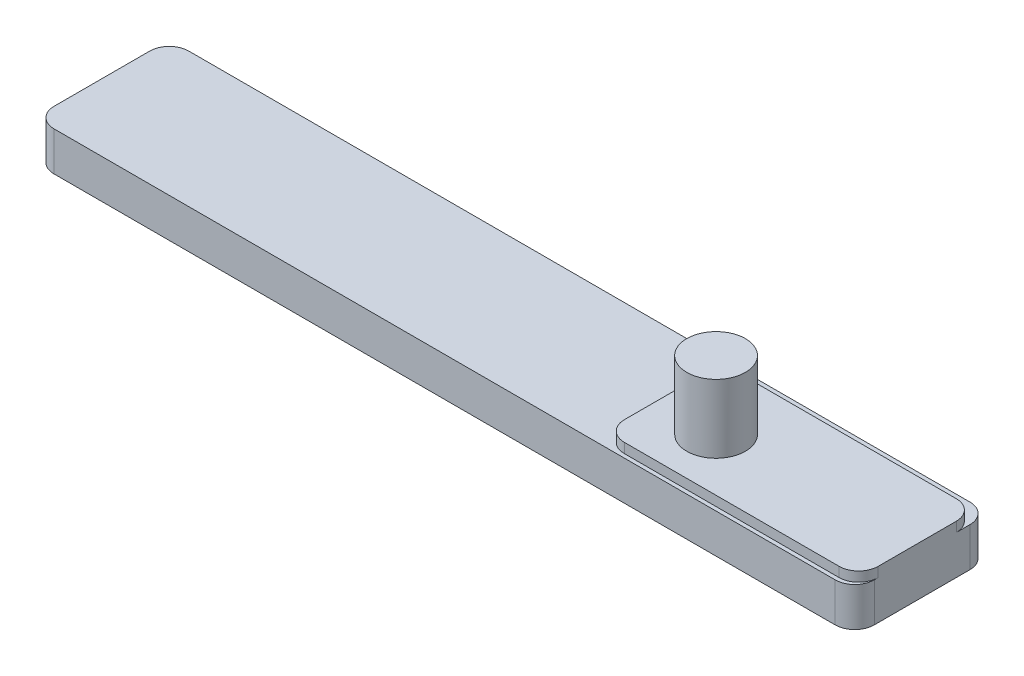
ISO-10303-21;
HEADER;
FILE_DESCRIPTION(('STEP AP214'),'2;1');
FILE_NAME('part.step','',(''),(''),'','','');
FILE_SCHEMA(('AUTOMOTIVE_DESIGN { 1 0 10303 214 1 1 1 1 }'));
ENDSEC;
DATA;
#1=APPLICATION_CONTEXT('core data for automotive mechanical design processes');
#2=APPLICATION_PROTOCOL_DEFINITION('international standard','automotive_design',2000,#1);
#3=PRODUCT_CONTEXT('',#1,'mechanical');
#4=PRODUCT('Part','Part','',(#3));
#5=PRODUCT_RELATED_PRODUCT_CATEGORY('part','',(#4));
#6=PRODUCT_DEFINITION_FORMATION('','',#4);
#7=PRODUCT_DEFINITION_CONTEXT('part definition',#1,'design');
#8=PRODUCT_DEFINITION('design','',#6,#7);
#9=PRODUCT_DEFINITION_SHAPE('','',#8);
#10=(LENGTH_UNIT() NAMED_UNIT(*) SI_UNIT(.MILLI.,.METRE.));
#11=(NAMED_UNIT(*) PLANE_ANGLE_UNIT() SI_UNIT($,.RADIAN.));
#12=(NAMED_UNIT(*) SI_UNIT($,.STERADIAN.) SOLID_ANGLE_UNIT());
#13=UNCERTAINTY_MEASURE_WITH_UNIT(LENGTH_MEASURE(1.E-05),#10,'distance_accuracy_value','');
#14=(GEOMETRIC_REPRESENTATION_CONTEXT(3) GLOBAL_UNCERTAINTY_ASSIGNED_CONTEXT((#13)) GLOBAL_UNIT_ASSIGNED_CONTEXT((#10,
#11,#12)) REPRESENTATION_CONTEXT('',''));
#15=CARTESIAN_POINT('',(0.,0.,0.));
#16=DIRECTION('',(0.,0.,1.));
#17=DIRECTION('',(1.,0.,0.));
#18=AXIS2_PLACEMENT_3D('',#15,#16,#17);
#19=CARTESIAN_POINT('',(0.,2.5,-7.4));
#20=DIRECTION('',(0.,0.,1.));
#21=DIRECTION('',(1.,0.,0.));
#22=AXIS2_PLACEMENT_3D('',#19,#20,#21);
#23=PLANE('',#22);
#24=DIRECTION('',(-1.,0.,0.));
#25=VECTOR('',#24,1.);
#26=CARTESIAN_POINT('',(0.,2.,-7.4));
#27=LINE('',#26,#25);
#28=CARTESIAN_POINT('',(41.,2.,-7.4));
#29=VERTEX_POINT('',#28);
#30=CARTESIAN_POINT('',(1.,2.,-7.4));
#31=VERTEX_POINT('',#30);
#32=EDGE_CURVE('E234',#29,#31,#27,.T.);
#33=ORIENTED_EDGE('',*,*,#32,.F.);
#34=DIRECTION('',(0.,-1.,0.));
#35=VECTOR('',#34,1.);
#36=CARTESIAN_POINT('',(41.,2.5,-7.4));
#37=LINE('',#36,#35);
#38=CARTESIAN_POINT('',(41.,0.,-7.4));
#39=VERTEX_POINT('',#38);
#40=EDGE_CURVE('E11',#29,#39,#37,.T.);
#41=ORIENTED_EDGE('',*,*,#40,.T.);
#42=DIRECTION('',(-1.,0.,0.));
#43=VECTOR('',#42,1.);
#44=CARTESIAN_POINT('',(0.,0.,-7.4));
#45=LINE('',#44,#43);
#46=CARTESIAN_POINT('',(1.,0.,-7.4));
#47=VERTEX_POINT('',#46);
#48=EDGE_CURVE('E246',#39,#47,#45,.T.);
#49=ORIENTED_EDGE('',*,*,#48,.T.);
#50=DIRECTION('',(0.,-1.,0.));
#51=VECTOR('',#50,1.);
#52=CARTESIAN_POINT('',(1.,2.5,-7.4));
#53=LINE('',#52,#51);
#54=EDGE_CURVE('E282',#47,#31,#53,.F.);
#55=ORIENTED_EDGE('',*,*,#54,.T.);
#56=EDGE_LOOP('',(#33,#41,#49,#55));
#57=FACE_BOUND('',#56,.T.);
#58=ADVANCED_FACE('F39',(#57),#23,.F.);
#59=CARTESIAN_POINT('',(0.,2.5,0.));
#60=DIRECTION('',(1.,0.,0.));
#61=DIRECTION('',(0.,0.,-1.));
#62=AXIS2_PLACEMENT_3D('',#59,#60,#61);
#63=PLANE('',#62);
#64=DIRECTION('',(0.,0.,1.));
#65=VECTOR('',#64,1.);
#66=CARTESIAN_POINT('',(0.,2.,-7.4));
#67=LINE('',#66,#65);
#68=CARTESIAN_POINT('',(0.,2.,-6.4));
#69=VERTEX_POINT('',#68);
#70=CARTESIAN_POINT('',(0.,2.,-1.5));
#71=VERTEX_POINT('',#70);
#72=EDGE_CURVE('E228',#69,#71,#67,.T.);
#73=ORIENTED_EDGE('',*,*,#72,.F.);
#74=DIRECTION('',(0.,-1.,0.));
#75=VECTOR('',#74,1.);
#76=CARTESIAN_POINT('',(0.,2.5,-6.4));
#77=LINE('',#76,#75);
#78=CARTESIAN_POINT('',(0.,0.,-6.4));
#79=VERTEX_POINT('',#78);
#80=EDGE_CURVE('E274',#69,#79,#77,.T.);
#81=ORIENTED_EDGE('',*,*,#80,.T.);
#82=DIRECTION('',(0.,0.,1.));
#83=VECTOR('',#82,1.);
#84=CARTESIAN_POINT('',(0.,0.,0.));
#85=LINE('',#84,#83);
#86=CARTESIAN_POINT('',(0.,0.,-1.5));
#87=VERTEX_POINT('',#86);
#88=EDGE_CURVE('E242',#79,#87,#85,.T.);
#89=ORIENTED_EDGE('',*,*,#88,.T.);
#90=DIRECTION('',(0.,1.,0.));
#91=VECTOR('',#90,1.);
#92=CARTESIAN_POINT('',(0.,2.5,-1.5));
#93=LINE('',#92,#91);
#94=EDGE_CURVE('E271',#87,#71,#93,.T.);
#95=ORIENTED_EDGE('',*,*,#94,.T.);
#96=EDGE_LOOP('',(#73,#81,#89,#95));
#97=FACE_BOUND('',#96,.T.);
#98=ADVANCED_FACE('F321',(#97),#63,.F.);
#99=CARTESIAN_POINT('',(42.,2.5,0.));
#100=DIRECTION('',(-1.,0.,0.));
#101=DIRECTION('',(0.,0.,1.));
#102=AXIS2_PLACEMENT_3D('',#99,#100,#101);
#103=PLANE('',#102);
#104=DIRECTION('',(0.,0.,1.));
#105=VECTOR('',#104,1.);
#106=CARTESIAN_POINT('',(42.,2.,0.));
#107=LINE('',#106,#105);
#108=CARTESIAN_POINT('',(42.,2.,-1.7));
#109=VERTEX_POINT('',#108);
#110=CARTESIAN_POINT('',(42.,2.,-1.5));
#111=VERTEX_POINT('',#110);
#112=EDGE_CURVE('E174',#109,#111,#107,.T.);
#113=ORIENTED_EDGE('',*,*,#112,.T.);
#114=DIRECTION('',(0.,1.,0.));
#115=VECTOR('',#114,1.);
#116=CARTESIAN_POINT('',(42.,2.5,-1.5));
#117=LINE('',#116,#115);
#118=CARTESIAN_POINT('',(42.,0.,-1.5));
#119=VERTEX_POINT('',#118);
#120=EDGE_CURVE('E198',#111,#119,#117,.F.);
#121=ORIENTED_EDGE('',*,*,#120,.T.);
#122=DIRECTION('',(0.,0.,-1.));
#123=VECTOR('',#122,1.);
#124=CARTESIAN_POINT('',(42.,0.,0.));
#125=LINE('',#124,#123);
#126=CARTESIAN_POINT('',(42.,0.,-6.4));
#127=VERTEX_POINT('',#126);
#128=EDGE_CURVE('E205',#119,#127,#125,.T.);
#129=ORIENTED_EDGE('',*,*,#128,.T.);
#130=DIRECTION('',(0.,-1.,0.));
#131=VECTOR('',#130,1.);
#132=CARTESIAN_POINT('',(42.,2.5,-6.4));
#133=LINE('',#132,#131);
#134=CARTESIAN_POINT('',(42.,2.,-6.4));
#135=VERTEX_POINT('',#134);
#136=EDGE_CURVE('E196',#127,#135,#133,.F.);
#137=ORIENTED_EDGE('',*,*,#136,.T.);
#138=DIRECTION('',(0.,0.,1.));
#139=VECTOR('',#138,1.);
#140=CARTESIAN_POINT('',(42.,2.,-7.4));
#141=LINE('',#140,#139);
#142=CARTESIAN_POINT('',(42.,2.,-5.7));
#143=VERTEX_POINT('',#142);
#144=EDGE_CURVE('E310',#135,#143,#141,.T.);
#145=ORIENTED_EDGE('',*,*,#144,.T.);
#146=DIRECTION('',(0.,1.,0.));
#147=VECTOR('',#146,1.);
#148=CARTESIAN_POINT('',(42.,2.5,-5.7));
#149=LINE('',#148,#147);
#150=CARTESIAN_POINT('',(42.,2.5,-5.7));
#151=VERTEX_POINT('',#150);
#152=EDGE_CURVE('E262',#143,#151,#149,.T.);
#153=ORIENTED_EDGE('',*,*,#152,.T.);
#154=DIRECTION('',(0.,0.,-1.));
#155=VECTOR('',#154,1.);
#156=CARTESIAN_POINT('',(42.,2.5,0.));
#157=LINE('',#156,#155);
#158=CARTESIAN_POINT('',(42.,2.5,-1.7));
#159=VERTEX_POINT('',#158);
#160=EDGE_CURVE('E243',#159,#151,#157,.T.);
#161=ORIENTED_EDGE('',*,*,#160,.F.);
#162=DIRECTION('',(0.,1.,0.));
#163=VECTOR('',#162,1.);
#164=CARTESIAN_POINT('',(42.,2.5,-1.7));
#165=LINE('',#164,#163);
#166=EDGE_CURVE('E223',#159,#109,#165,.F.);
#167=ORIENTED_EDGE('',*,*,#166,.T.);
#168=EDGE_LOOP('',(#113,#121,#129,#137,#145,#153,#161,#167));
#169=FACE_BOUND('',#168,.T.);
#170=ADVANCED_FACE('F220',(#169),#103,.F.);
#171=CARTESIAN_POINT('',(0.,2.5,0.));
#172=DIRECTION('',(0.,-1.,0.));
#173=DIRECTION('',(0.,0.,-1.));
#174=AXIS2_PLACEMENT_3D('',#171,#172,#173);
#175=PLANE('',#174);
#176=CARTESIAN_POINT('',(32.,2.5,-3.4));
#177=DIRECTION('',(0.,-1.,0.));
#178=DIRECTION('',(0.,0.,-1.));
#179=AXIS2_PLACEMENT_3D('',#176,#177,#178);
#180=CIRCLE('',#179,1.50000000000001);
#181=CARTESIAN_POINT('',(32.,2.5,-4.90000000000001));
#182=VERTEX_POINT('',#181);
#183=EDGE_CURVE('E164',#182,#182,#180,.F.);
#184=ORIENTED_EDGE('',*,*,#183,.F.);
#185=EDGE_LOOP('',(#184));
#186=FACE_BOUND('',#185,.T.);
#187=DIRECTION('',(-1.,0.,0.));
#188=VECTOR('',#187,1.);
#189=CARTESIAN_POINT('',(29.,2.5,-0.7));
#190=LINE('',#189,#188);
#191=CARTESIAN_POINT('',(41.,2.5,-0.7));
#192=VERTEX_POINT('',#191);
#193=CARTESIAN_POINT('',(30.,2.5,-0.7));
#194=VERTEX_POINT('',#193);
#195=EDGE_CURVE('E160',#192,#194,#190,.T.);
#196=ORIENTED_EDGE('',*,*,#195,.F.);
#197=CARTESIAN_POINT('',(41.,2.5,-1.7));
#198=DIRECTION('',(0.,-1.,0.));
#199=DIRECTION('',(0.,0.,-1.));
#200=AXIS2_PLACEMENT_3D('',#197,#198,#199);
#201=CIRCLE('',#200,1.);
#202=EDGE_CURVE('E260',#192,#159,#201,.F.);
#203=ORIENTED_EDGE('',*,*,#202,.T.);
#204=ORIENTED_EDGE('',*,*,#160,.T.);
#205=CARTESIAN_POINT('',(41.,2.5,-5.7));
#206=DIRECTION('',(0.,-1.,0.));
#207=DIRECTION('',(0.,0.,-1.));
#208=AXIS2_PLACEMENT_3D('',#205,#206,#207);
#209=CIRCLE('',#208,1.);
#210=CARTESIAN_POINT('',(41.,2.5,-6.7));
#211=VERTEX_POINT('',#210);
#212=EDGE_CURVE('E258',#151,#211,#209,.F.);
#213=ORIENTED_EDGE('',*,*,#212,.T.);
#214=DIRECTION('',(1.,0.,0.));
#215=VECTOR('',#214,1.);
#216=CARTESIAN_POINT('',(29.,2.5,-6.7));
#217=LINE('',#216,#215);
#218=CARTESIAN_POINT('',(30.,2.5,-6.7));
#219=VERTEX_POINT('',#218);
#220=EDGE_CURVE('E225',#219,#211,#217,.T.);
#221=ORIENTED_EDGE('',*,*,#220,.F.);
#222=CARTESIAN_POINT('',(30.,2.5,-5.7));
#223=DIRECTION('',(0.,-1.,0.));
#224=DIRECTION('',(0.,0.,-1.));
#225=AXIS2_PLACEMENT_3D('',#222,#223,#224);
#226=CIRCLE('',#225,1.);
#227=CARTESIAN_POINT('',(29.,2.5,-5.7));
#228=VERTEX_POINT('',#227);
#229=EDGE_CURVE('E254',#219,#228,#226,.F.);
#230=ORIENTED_EDGE('',*,*,#229,.T.);
#231=DIRECTION('',(0.,0.,-1.));
#232=VECTOR('',#231,1.);
#233=CARTESIAN_POINT('',(29.,2.5,-7.4));
#234=LINE('',#233,#232);
#235=CARTESIAN_POINT('',(29.,2.5,-1.7));
#236=VERTEX_POINT('',#235);
#237=EDGE_CURVE('E232',#236,#228,#234,.T.);
#238=ORIENTED_EDGE('',*,*,#237,.F.);
#239=CARTESIAN_POINT('',(30.,2.5,-1.7));
#240=DIRECTION('',(0.,-1.,0.));
#241=DIRECTION('',(0.,0.,-1.));
#242=AXIS2_PLACEMENT_3D('',#239,#240,#241);
#243=CIRCLE('',#242,1.);
#244=EDGE_CURVE('E256',#236,#194,#243,.F.);
#245=ORIENTED_EDGE('',*,*,#244,.T.);
#246=EDGE_LOOP('',(#196,#203,#204,#213,#221,#230,#238,#245));
#247=FACE_BOUND('',#246,.T.);
#248=ADVANCED_FACE('F297',(#186,#247),#175,.F.);
#249=CARTESIAN_POINT('',(0.,0.,0.));
#250=DIRECTION('',(0.,-1.,0.));
#251=DIRECTION('',(0.,0.,-1.));
#252=AXIS2_PLACEMENT_3D('',#249,#250,#251);
#253=PLANE('',#252);
#254=ORIENTED_EDGE('',*,*,#128,.F.);
#255=CARTESIAN_POINT('',(41.,0.,-1.5));
#256=DIRECTION('',(0.,-1.,0.));
#257=DIRECTION('',(0.,0.,-1.));
#258=AXIS2_PLACEMENT_3D('',#255,#256,#257);
#259=CIRCLE('',#258,1.);
#260=CARTESIAN_POINT('',(41.,0.,-0.5));
#261=VERTEX_POINT('',#260);
#262=EDGE_CURVE('E47',#119,#261,#259,.T.);
#263=ORIENTED_EDGE('',*,*,#262,.T.);
#264=DIRECTION('',(-1.,0.,0.));
#265=VECTOR('',#264,1.);
#266=CARTESIAN_POINT('',(0.,0.,-0.5));
#267=LINE('',#266,#265);
#268=CARTESIAN_POINT('',(1.,0.,-0.5));
#269=VERTEX_POINT('',#268);
#270=EDGE_CURVE('E203',#261,#269,#267,.T.);
#271=ORIENTED_EDGE('',*,*,#270,.T.);
#272=CARTESIAN_POINT('',(1.,0.,-1.5));
#273=DIRECTION('',(0.,-1.,0.));
#274=DIRECTION('',(0.,0.,-1.));
#275=AXIS2_PLACEMENT_3D('',#272,#273,#274);
#276=CIRCLE('',#275,1.);
#277=EDGE_CURVE('E277',#269,#87,#276,.T.);
#278=ORIENTED_EDGE('',*,*,#277,.T.);
#279=ORIENTED_EDGE('',*,*,#88,.F.);
#280=CARTESIAN_POINT('',(1.,0.,-6.4));
#281=DIRECTION('',(0.,-1.,0.));
#282=DIRECTION('',(0.,0.,-1.));
#283=AXIS2_PLACEMENT_3D('',#280,#281,#282);
#284=CIRCLE('',#283,1.);
#285=EDGE_CURVE('E279',#79,#47,#284,.T.);
#286=ORIENTED_EDGE('',*,*,#285,.T.);
#287=ORIENTED_EDGE('',*,*,#48,.F.);
#288=CARTESIAN_POINT('',(41.,0.,-6.4));
#289=DIRECTION('',(0.,-1.,0.));
#290=DIRECTION('',(0.,0.,-1.));
#291=AXIS2_PLACEMENT_3D('',#288,#289,#290);
#292=CIRCLE('',#291,1.);
#293=EDGE_CURVE('E54',#39,#127,#292,.T.);
#294=ORIENTED_EDGE('',*,*,#293,.T.);
#295=EDGE_LOOP('',(#254,#263,#271,#278,#279,#286,#287,#294));
#296=FACE_BOUND('',#295,.T.);
#297=ADVANCED_FACE('F202',(#296),#253,.T.);
#298=CARTESIAN_POINT('',(32.,6.,-3.4));
#299=DIRECTION('',(0.,-1.,0.));
#300=DIRECTION('',(0.,0.,-1.));
#301=AXIS2_PLACEMENT_3D('',#298,#299,#300);
#302=CYLINDRICAL_SURFACE('',#301,1.50000000000001);
#303=CARTESIAN_POINT('',(32.,6.,-3.4));
#304=DIRECTION('',(0.,1.,0.));
#305=DIRECTION('',(0.,0.,1.));
#306=AXIS2_PLACEMENT_3D('',#303,#304,#305);
#307=CIRCLE('',#306,1.50000000000001);
#308=CARTESIAN_POINT('',(32.,6.,-1.89999999999999));
#309=VERTEX_POINT('',#308);
#310=EDGE_CURVE('E236',#309,#309,#307,.T.);
#311=ORIENTED_EDGE('',*,*,#310,.F.);
#312=EDGE_LOOP('',(#311));
#313=FACE_BOUND('',#312,.T.);
#314=ORIENTED_EDGE('',*,*,#183,.T.);
#315=EDGE_LOOP('',(#314));
#316=FACE_BOUND('',#315,.T.);
#317=ADVANCED_FACE('F361',(#313,#316),#302,.T.);
#318=CARTESIAN_POINT('',(32.,6.,-3.4));
#319=DIRECTION('',(0.,1.,0.));
#320=DIRECTION('',(0.,0.,1.));
#321=AXIS2_PLACEMENT_3D('',#318,#319,#320);
#322=PLANE('',#321);
#323=ORIENTED_EDGE('',*,*,#310,.T.);
#324=EDGE_LOOP('',(#323));
#325=FACE_BOUND('',#324,.T.);
#326=ADVANCED_FACE('F366',(#325),#322,.T.);
#327=CARTESIAN_POINT('',(29.,2.,-7.4));
#328=DIRECTION('',(1.,0.,0.));
#329=DIRECTION('',(0.,0.,-1.));
#330=AXIS2_PLACEMENT_3D('',#327,#328,#329);
#331=PLANE('',#330);
#332=DIRECTION('',(0.,0.,-1.));
#333=VECTOR('',#332,1.);
#334=CARTESIAN_POINT('',(29.,2.,-7.4));
#335=LINE('',#334,#333);
#336=CARTESIAN_POINT('',(29.,2.,-1.7));
#337=VERTEX_POINT('',#336);
#338=CARTESIAN_POINT('',(29.,2.,-5.7));
#339=VERTEX_POINT('',#338);
#340=EDGE_CURVE('E231',#337,#339,#335,.T.);
#341=ORIENTED_EDGE('',*,*,#340,.F.);
#342=DIRECTION('',(0.,1.,0.));
#343=VECTOR('',#342,1.);
#344=CARTESIAN_POINT('',(29.,2.,-1.7));
#345=LINE('',#344,#343);
#346=EDGE_CURVE('E180',#337,#236,#345,.T.);
#347=ORIENTED_EDGE('',*,*,#346,.T.);
#348=ORIENTED_EDGE('',*,*,#237,.T.);
#349=DIRECTION('',(0.,1.,0.));
#350=VECTOR('',#349,1.);
#351=CARTESIAN_POINT('',(29.,2.,-5.7));
#352=LINE('',#351,#350);
#353=EDGE_CURVE('E289',#228,#339,#352,.F.);
#354=ORIENTED_EDGE('',*,*,#353,.T.);
#355=EDGE_LOOP('',(#341,#347,#348,#354));
#356=FACE_BOUND('',#355,.T.);
#357=ADVANCED_FACE('F294',(#356),#331,.F.);
#358=CARTESIAN_POINT('',(0.,2.,0.));
#359=DIRECTION('',(0.,1.,0.));
#360=DIRECTION('',(0.,0.,1.));
#361=AXIS2_PLACEMENT_3D('',#358,#359,#360);
#362=PLANE('',#361);
#363=DIRECTION('',(-1.,0.,0.));
#364=VECTOR('',#363,1.);
#365=CARTESIAN_POINT('',(0.,2.,-0.5));
#366=LINE('',#365,#364);
#367=CARTESIAN_POINT('',(41.,2.,-0.5));
#368=VERTEX_POINT('',#367);
#369=CARTESIAN_POINT('',(1.,2.,-0.5));
#370=VERTEX_POINT('',#369);
#371=EDGE_CURVE('E175',#368,#370,#366,.T.);
#372=ORIENTED_EDGE('',*,*,#371,.F.);
#373=CARTESIAN_POINT('',(41.,2.,-1.5));
#374=DIRECTION('',(0.,1.,0.));
#375=DIRECTION('',(0.,0.,1.));
#376=AXIS2_PLACEMENT_3D('',#373,#374,#375);
#377=CIRCLE('',#376,1.);
#378=EDGE_CURVE('E194',#368,#111,#377,.T.);
#379=ORIENTED_EDGE('',*,*,#378,.T.);
#380=ORIENTED_EDGE('',*,*,#112,.F.);
#381=CARTESIAN_POINT('',(41.,2.,-1.7));
#382=DIRECTION('',(0.,1.,0.));
#383=DIRECTION('',(0.,0.,1.));
#384=AXIS2_PLACEMENT_3D('',#381,#382,#383);
#385=CIRCLE('',#384,1.);
#386=CARTESIAN_POINT('',(41.,2.,-0.7));
#387=VERTEX_POINT('',#386);
#388=EDGE_CURVE('E173',#109,#387,#385,.F.);
#389=ORIENTED_EDGE('',*,*,#388,.T.);
#390=DIRECTION('',(1.,0.,0.));
#391=VECTOR('',#390,1.);
#392=CARTESIAN_POINT('',(29.,2.,-0.7));
#393=LINE('',#392,#391);
#394=CARTESIAN_POINT('',(30.,2.,-0.7));
#395=VERTEX_POINT('',#394);
#396=EDGE_CURVE('E157',#395,#387,#393,.T.);
#397=ORIENTED_EDGE('',*,*,#396,.F.);
#398=CARTESIAN_POINT('',(30.,2.,-1.7));
#399=DIRECTION('',(0.,1.,0.));
#400=DIRECTION('',(0.,0.,1.));
#401=AXIS2_PLACEMENT_3D('',#398,#399,#400);
#402=CIRCLE('',#401,1.);
#403=EDGE_CURVE('E170',#395,#337,#402,.F.);
#404=ORIENTED_EDGE('',*,*,#403,.T.);
#405=ORIENTED_EDGE('',*,*,#340,.T.);
#406=CARTESIAN_POINT('',(30.,2.,-5.7));
#407=DIRECTION('',(0.,1.,0.));
#408=DIRECTION('',(0.,0.,1.));
#409=AXIS2_PLACEMENT_3D('',#406,#407,#408);
#410=CIRCLE('',#409,1.);
#411=CARTESIAN_POINT('',(30.,2.,-6.7));
#412=VERTEX_POINT('',#411);
#413=EDGE_CURVE('E181',#339,#412,#410,.F.);
#414=ORIENTED_EDGE('',*,*,#413,.T.);
#415=DIRECTION('',(-1.,0.,0.));
#416=VECTOR('',#415,1.);
#417=CARTESIAN_POINT('',(29.,2.,-6.7));
#418=LINE('',#417,#416);
#419=CARTESIAN_POINT('',(41.,2.,-6.7));
#420=VERTEX_POINT('',#419);
#421=EDGE_CURVE('E239',#420,#412,#418,.T.);
#422=ORIENTED_EDGE('',*,*,#421,.F.);
#423=CARTESIAN_POINT('',(41.,2.,-5.7));
#424=DIRECTION('',(0.,1.,0.));
#425=DIRECTION('',(0.,0.,1.));
#426=AXIS2_PLACEMENT_3D('',#423,#424,#425);
#427=CIRCLE('',#426,1.);
#428=EDGE_CURVE('E182',#420,#143,#427,.F.);
#429=ORIENTED_EDGE('',*,*,#428,.T.);
#430=ORIENTED_EDGE('',*,*,#144,.F.);
#431=CARTESIAN_POINT('',(41.,2.,-6.4));
#432=DIRECTION('',(0.,1.,0.));
#433=DIRECTION('',(0.,0.,1.));
#434=AXIS2_PLACEMENT_3D('',#431,#432,#433);
#435=CIRCLE('',#434,1.);
#436=EDGE_CURVE('E192',#135,#29,#435,.T.);
#437=ORIENTED_EDGE('',*,*,#436,.T.);
#438=ORIENTED_EDGE('',*,*,#32,.T.);
#439=CARTESIAN_POINT('',(1.,2.,-6.4));
#440=DIRECTION('',(0.,1.,0.));
#441=DIRECTION('',(0.,0.,1.));
#442=AXIS2_PLACEMENT_3D('',#439,#440,#441);
#443=CIRCLE('',#442,1.);
#444=EDGE_CURVE('E287',#31,#69,#443,.T.);
#445=ORIENTED_EDGE('',*,*,#444,.T.);
#446=ORIENTED_EDGE('',*,*,#72,.T.);
#447=CARTESIAN_POINT('',(1.,2.,-1.5));
#448=DIRECTION('',(0.,1.,0.));
#449=DIRECTION('',(0.,0.,1.));
#450=AXIS2_PLACEMENT_3D('',#447,#448,#449);
#451=CIRCLE('',#450,1.);
#452=EDGE_CURVE('E285',#71,#370,#451,.T.);
#453=ORIENTED_EDGE('',*,*,#452,.T.);
#454=EDGE_LOOP('',(#372,#379,#380,#389,#397,#404,#405,#414,#422,#429,#430,#437,#438,#445,#446,#453));
#455=FACE_BOUND('',#454,.T.);
#456=ADVANCED_FACE('F168',(#455),#362,.T.);
#457=CARTESIAN_POINT('',(29.,-11.0188325129406,-0.7));
#458=DIRECTION('',(0.,0.,-1.));
#459=DIRECTION('',(-1.,0.,0.));
#460=AXIS2_PLACEMENT_3D('',#457,#458,#459);
#461=PLANE('',#460);
#462=ORIENTED_EDGE('',*,*,#396,.T.);
#463=DIRECTION('',(0.,1.,0.));
#464=VECTOR('',#463,1.);
#465=CARTESIAN_POINT('',(41.,-11.0188325129406,-0.7));
#466=LINE('',#465,#464);
#467=EDGE_CURVE('E163',#387,#192,#466,.T.);
#468=ORIENTED_EDGE('',*,*,#467,.T.);
#469=ORIENTED_EDGE('',*,*,#195,.T.);
#470=DIRECTION('',(0.,1.,0.));
#471=VECTOR('',#470,1.);
#472=CARTESIAN_POINT('',(30.,-11.0188325129406,-0.7));
#473=LINE('',#472,#471);
#474=EDGE_CURVE('E153',#194,#395,#473,.F.);
#475=ORIENTED_EDGE('',*,*,#474,.T.);
#476=EDGE_LOOP('',(#462,#468,#469,#475));
#477=FACE_BOUND('',#476,.T.);
#478=ADVANCED_FACE('F155',(#477),#461,.F.);
#479=CARTESIAN_POINT('',(29.,-11.0188325129406,-6.7));
#480=DIRECTION('',(0.,0.,1.));
#481=DIRECTION('',(1.,0.,0.));
#482=AXIS2_PLACEMENT_3D('',#479,#480,#481);
#483=PLANE('',#482);
#484=ORIENTED_EDGE('',*,*,#220,.T.);
#485=DIRECTION('',(0.,1.,0.));
#486=VECTOR('',#485,1.);
#487=CARTESIAN_POINT('',(41.,-11.0188325129406,-6.7));
#488=LINE('',#487,#486);
#489=EDGE_CURVE('E269',#211,#420,#488,.F.);
#490=ORIENTED_EDGE('',*,*,#489,.T.);
#491=ORIENTED_EDGE('',*,*,#421,.T.);
#492=DIRECTION('',(0.,1.,0.));
#493=VECTOR('',#492,1.);
#494=CARTESIAN_POINT('',(30.,-11.0188325129406,-6.7));
#495=LINE('',#494,#493);
#496=EDGE_CURVE('E266',#412,#219,#495,.T.);
#497=ORIENTED_EDGE('',*,*,#496,.T.);
#498=EDGE_LOOP('',(#484,#490,#491,#497));
#499=FACE_BOUND('',#498,.T.);
#500=ADVANCED_FACE('F306',(#499),#483,.F.);
#501=CARTESIAN_POINT('',(0.,-0.00100000000000013,-0.5));
#502=DIRECTION('',(0.,0.,-1.));
#503=DIRECTION('',(-1.,0.,0.));
#504=AXIS2_PLACEMENT_3D('',#501,#502,#503);
#505=PLANE('',#504);
#506=ORIENTED_EDGE('',*,*,#270,.F.);
#507=DIRECTION('',(0.,1.,0.));
#508=VECTOR('',#507,1.);
#509=CARTESIAN_POINT('',(41.,-0.00100000000000013,-0.5));
#510=LINE('',#509,#508);
#511=EDGE_CURVE('E184',#261,#368,#510,.T.);
#512=ORIENTED_EDGE('',*,*,#511,.T.);
#513=ORIENTED_EDGE('',*,*,#371,.T.);
#514=DIRECTION('',(0.,1.,0.));
#515=VECTOR('',#514,1.);
#516=CARTESIAN_POINT('',(1.,-0.00100000000000013,-0.5));
#517=LINE('',#516,#515);
#518=EDGE_CURVE('E212',#370,#269,#517,.F.);
#519=ORIENTED_EDGE('',*,*,#518,.T.);
#520=EDGE_LOOP('',(#506,#512,#513,#519));
#521=FACE_BOUND('',#520,.T.);
#522=ADVANCED_FACE('F210',(#521),#505,.F.);
#523=CARTESIAN_POINT('',(41.,-11.0188325129406,-1.7));
#524=DIRECTION('',(0.,1.,0.));
#525=DIRECTION('',(0.,0.,1.));
#526=AXIS2_PLACEMENT_3D('',#523,#524,#525);
#527=CYLINDRICAL_SURFACE('',#526,1.);
#528=ORIENTED_EDGE('',*,*,#388,.F.);
#529=ORIENTED_EDGE('',*,*,#166,.F.);
#530=ORIENTED_EDGE('',*,*,#202,.F.);
#531=ORIENTED_EDGE('',*,*,#467,.F.);
#532=EDGE_LOOP('',(#528,#529,#530,#531));
#533=FACE_BOUND('',#532,.T.);
#534=ADVANCED_FACE('F334',(#533),#527,.T.);
#535=CARTESIAN_POINT('',(41.,2.5,-5.7));
#536=DIRECTION('',(0.,1.,0.));
#537=DIRECTION('',(0.,0.,1.));
#538=AXIS2_PLACEMENT_3D('',#535,#536,#537);
#539=CYLINDRICAL_SURFACE('',#538,1.);
#540=ORIENTED_EDGE('',*,*,#428,.F.);
#541=ORIENTED_EDGE('',*,*,#489,.F.);
#542=ORIENTED_EDGE('',*,*,#212,.F.);
#543=ORIENTED_EDGE('',*,*,#152,.F.);
#544=EDGE_LOOP('',(#540,#541,#542,#543));
#545=FACE_BOUND('',#544,.T.);
#546=ADVANCED_FACE('F336',(#545),#539,.T.);
#547=CARTESIAN_POINT('',(1.,2.5,-6.4));
#548=DIRECTION('',(0.,-1.,0.));
#549=DIRECTION('',(0.,0.,-1.));
#550=AXIS2_PLACEMENT_3D('',#547,#548,#549);
#551=CYLINDRICAL_SURFACE('',#550,1.);
#552=ORIENTED_EDGE('',*,*,#444,.F.);
#553=ORIENTED_EDGE('',*,*,#54,.F.);
#554=ORIENTED_EDGE('',*,*,#285,.F.);
#555=ORIENTED_EDGE('',*,*,#80,.F.);
#556=EDGE_LOOP('',(#552,#553,#554,#555));
#557=FACE_BOUND('',#556,.T.);
#558=ADVANCED_FACE('F325',(#557),#551,.T.);
#559=CARTESIAN_POINT('',(30.,2.,-1.7));
#560=DIRECTION('',(0.,1.,0.));
#561=DIRECTION('',(0.,0.,1.));
#562=AXIS2_PLACEMENT_3D('',#559,#560,#561);
#563=CYLINDRICAL_SURFACE('',#562,1.);
#564=ORIENTED_EDGE('',*,*,#403,.F.);
#565=ORIENTED_EDGE('',*,*,#474,.F.);
#566=ORIENTED_EDGE('',*,*,#244,.F.);
#567=ORIENTED_EDGE('',*,*,#346,.F.);
#568=EDGE_LOOP('',(#564,#565,#566,#567));
#569=FACE_BOUND('',#568,.T.);
#570=ADVANCED_FACE('F178',(#569),#563,.T.);
#571=CARTESIAN_POINT('',(30.,-11.0188325129406,-5.7));
#572=DIRECTION('',(0.,1.,0.));
#573=DIRECTION('',(0.,0.,1.));
#574=AXIS2_PLACEMENT_3D('',#571,#572,#573);
#575=CYLINDRICAL_SURFACE('',#574,1.);
#576=ORIENTED_EDGE('',*,*,#413,.F.);
#577=ORIENTED_EDGE('',*,*,#353,.F.);
#578=ORIENTED_EDGE('',*,*,#229,.F.);
#579=ORIENTED_EDGE('',*,*,#496,.F.);
#580=EDGE_LOOP('',(#576,#577,#578,#579));
#581=FACE_BOUND('',#580,.T.);
#582=ADVANCED_FACE('F303',(#581),#575,.T.);
#583=CARTESIAN_POINT('',(1.,2.5,-1.5));
#584=DIRECTION('',(0.,1.,0.));
#585=DIRECTION('',(0.,0.,1.));
#586=AXIS2_PLACEMENT_3D('',#583,#584,#585);
#587=CYLINDRICAL_SURFACE('',#586,1.);
#588=ORIENTED_EDGE('',*,*,#277,.F.);
#589=ORIENTED_EDGE('',*,*,#518,.F.);
#590=ORIENTED_EDGE('',*,*,#452,.F.);
#591=ORIENTED_EDGE('',*,*,#94,.F.);
#592=EDGE_LOOP('',(#588,#589,#590,#591));
#593=FACE_BOUND('',#592,.T.);
#594=ADVANCED_FACE('F318',(#593),#587,.T.);
#595=CARTESIAN_POINT('',(41.,-0.00100000000000013,-1.5));
#596=DIRECTION('',(0.,1.,0.));
#597=DIRECTION('',(0.,0.,1.));
#598=AXIS2_PLACEMENT_3D('',#595,#596,#597);
#599=CYLINDRICAL_SURFACE('',#598,1.);
#600=ORIENTED_EDGE('',*,*,#262,.F.);
#601=ORIENTED_EDGE('',*,*,#120,.F.);
#602=ORIENTED_EDGE('',*,*,#378,.F.);
#603=ORIENTED_EDGE('',*,*,#511,.F.);
#604=EDGE_LOOP('',(#600,#601,#602,#603));
#605=FACE_BOUND('',#604,.T.);
#606=ADVANCED_FACE('F215',(#605),#599,.T.);
#607=CARTESIAN_POINT('',(41.,2.5,-6.4));
#608=DIRECTION('',(0.,-1.,0.));
#609=DIRECTION('',(0.,0.,-1.));
#610=AXIS2_PLACEMENT_3D('',#607,#608,#609);
#611=CYLINDRICAL_SURFACE('',#610,1.);
#612=ORIENTED_EDGE('',*,*,#436,.F.);
#613=ORIENTED_EDGE('',*,*,#136,.F.);
#614=ORIENTED_EDGE('',*,*,#293,.F.);
#615=ORIENTED_EDGE('',*,*,#40,.F.);
#616=EDGE_LOOP('',(#612,#613,#614,#615));
#617=FACE_BOUND('',#616,.T.);
#618=ADVANCED_FACE('F41',(#617),#611,.T.);
#619=CLOSED_SHELL('',(#58,#98,#170,#248,#297,#317,#326,#357,#456,#478,#500,#522,#534,#546,#558,
#570,#582,#594,#606,#618));
#620=MANIFOLD_SOLID_BREP('B2',#619);
#621=ADVANCED_BREP_SHAPE_REPRESENTATION('',(#18,#620),#14);
#622=SHAPE_DEFINITION_REPRESENTATION(#9,#621);
ENDSEC;
END-ISO-10303-21;
